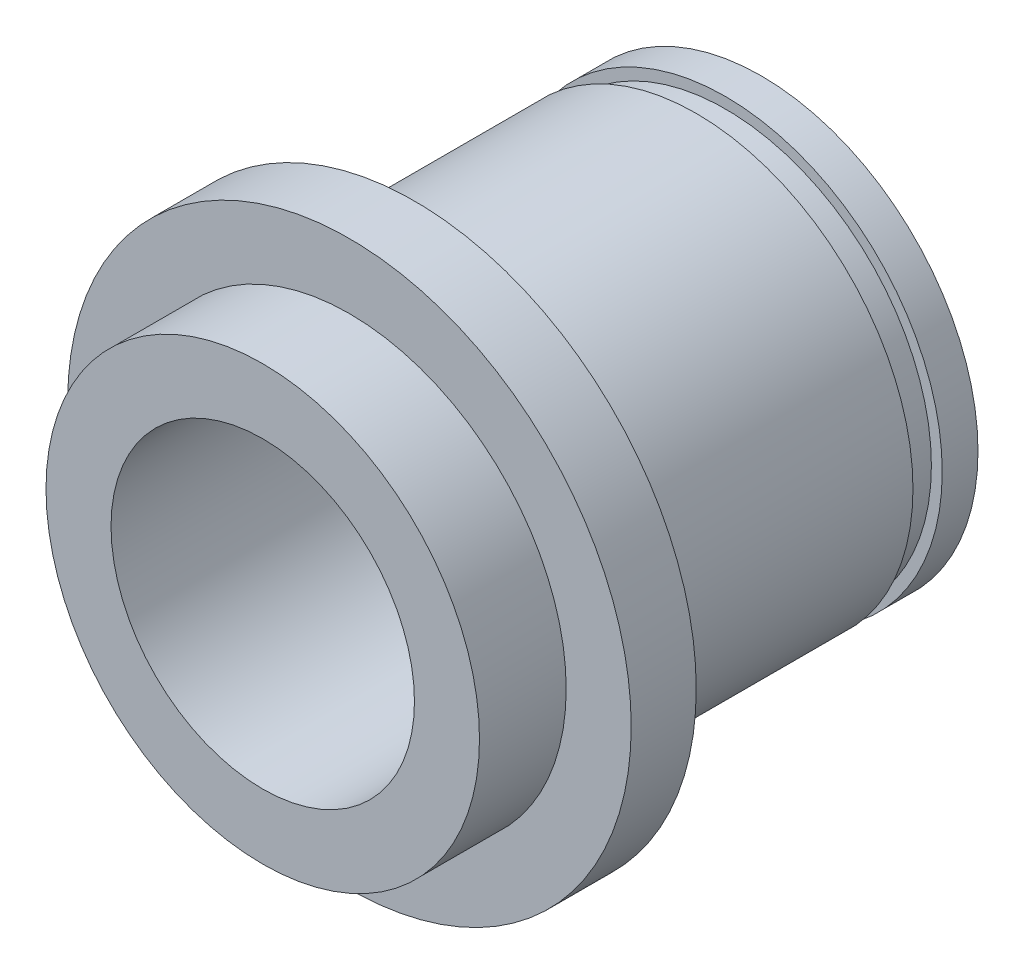
ISO-10303-21;
HEADER;
FILE_DESCRIPTION(('STEP AP214'),'2;1');
FILE_NAME('part.step','',(''),(''),'','','');
FILE_SCHEMA(('AUTOMOTIVE_DESIGN { 1 0 10303 214 1 1 1 1 }'));
ENDSEC;
DATA;
#1=APPLICATION_CONTEXT('core data for automotive mechanical design processes');
#2=APPLICATION_PROTOCOL_DEFINITION('international standard','automotive_design',2000,#1);
#3=PRODUCT_CONTEXT('',#1,'mechanical');
#4=PRODUCT('Part','Part','',(#3));
#5=PRODUCT_RELATED_PRODUCT_CATEGORY('part','',(#4));
#6=PRODUCT_DEFINITION_FORMATION('','',#4);
#7=PRODUCT_DEFINITION_CONTEXT('part definition',#1,'design');
#8=PRODUCT_DEFINITION('design','',#6,#7);
#9=PRODUCT_DEFINITION_SHAPE('','',#8);
#10=(LENGTH_UNIT() NAMED_UNIT(*) SI_UNIT(.MILLI.,.METRE.));
#11=(NAMED_UNIT(*) PLANE_ANGLE_UNIT() SI_UNIT($,.RADIAN.));
#12=(NAMED_UNIT(*) SI_UNIT($,.STERADIAN.) SOLID_ANGLE_UNIT());
#13=UNCERTAINTY_MEASURE_WITH_UNIT(LENGTH_MEASURE(1.E-05),#10,'distance_accuracy_value','');
#14=(GEOMETRIC_REPRESENTATION_CONTEXT(3) GLOBAL_UNCERTAINTY_ASSIGNED_CONTEXT((#13)) GLOBAL_UNIT_ASSIGNED_CONTEXT((#10,
#11,#12)) REPRESENTATION_CONTEXT('',''));
#15=CARTESIAN_POINT('',(0.,0.,0.));
#16=DIRECTION('',(0.,0.,1.));
#17=DIRECTION('',(1.,0.,0.));
#18=AXIS2_PLACEMENT_3D('',#15,#16,#17);
#19=CARTESIAN_POINT('',(0.,0.,7.));
#20=DIRECTION('',(0.,0.,-1.));
#21=DIRECTION('',(-1.,0.,0.));
#22=AXIS2_PLACEMENT_3D('',#19,#20,#21);
#23=PLANE('',#22);
#24=CARTESIAN_POINT('',(0.,0.,7.));
#25=DIRECTION('',(0.,0.,-1.));
#26=DIRECTION('',(-1.,0.,0.));
#27=AXIS2_PLACEMENT_3D('',#24,#25,#26);
#28=CIRCLE('',#27,7.);
#29=CARTESIAN_POINT('',(-7.,0.,7.));
#30=VERTEX_POINT('',#29);
#31=EDGE_CURVE('E76',#30,#30,#28,.T.);
#32=ORIENTED_EDGE('',*,*,#31,.T.);
#33=EDGE_LOOP('',(#32));
#34=FACE_BOUND('',#33,.T.);
#35=CARTESIAN_POINT('',(0.,0.,7.));
#36=DIRECTION('',(0.,0.,1.));
#37=DIRECTION('',(1.,0.,0.));
#38=AXIS2_PLACEMENT_3D('',#35,#36,#37);
#39=CIRCLE('',#38,10.);
#40=CARTESIAN_POINT('',(10.,0.,7.));
#41=VERTEX_POINT('',#40);
#42=EDGE_CURVE('E10',#41,#41,#39,.T.);
#43=ORIENTED_EDGE('',*,*,#42,.T.);
#44=EDGE_LOOP('',(#43));
#45=FACE_BOUND('',#44,.T.);
#46=ADVANCED_FACE('F39',(#34,#45),#23,.F.);
#47=CARTESIAN_POINT('',(0.,0.,15.9040178571429));
#48=DIRECTION('',(0.,0.,1.));
#49=DIRECTION('',(1.,0.,0.));
#50=AXIS2_PLACEMENT_3D('',#47,#48,#49);
#51=CYLINDRICAL_SURFACE('',#50,10.);
#52=ORIENTED_EDGE('',*,*,#42,.F.);
#53=EDGE_LOOP('',(#52));
#54=FACE_BOUND('',#53,.T.);
#55=CARTESIAN_POINT('',(0.,0.,3.));
#56=DIRECTION('',(0.,0.,1.));
#57=DIRECTION('',(1.,0.,0.));
#58=AXIS2_PLACEMENT_3D('',#55,#56,#57);
#59=CIRCLE('',#58,10.);
#60=CARTESIAN_POINT('',(10.,0.,3.));
#61=VERTEX_POINT('',#60);
#62=EDGE_CURVE('E45',#61,#61,#59,.T.);
#63=ORIENTED_EDGE('',*,*,#62,.T.);
#64=EDGE_LOOP('',(#63));
#65=FACE_BOUND('',#64,.T.);
#66=ADVANCED_FACE('F93',(#54,#65),#51,.T.);
#67=CARTESIAN_POINT('',(0.,10.,3.));
#68=DIRECTION('',(0.,0.,-1.));
#69=DIRECTION('',(-1.,0.,0.));
#70=AXIS2_PLACEMENT_3D('',#67,#68,#69);
#71=PLANE('',#70);
#72=ORIENTED_EDGE('',*,*,#62,.F.);
#73=EDGE_LOOP('',(#72));
#74=FACE_BOUND('',#73,.T.);
#75=CARTESIAN_POINT('',(0.,0.,3.));
#76=DIRECTION('',(0.,0.,1.));
#77=DIRECTION('',(1.,0.,0.));
#78=AXIS2_PLACEMENT_3D('',#75,#76,#77);
#79=CIRCLE('',#78,13.);
#80=CARTESIAN_POINT('',(13.,0.,3.));
#81=VERTEX_POINT('',#80);
#82=EDGE_CURVE('E49',#81,#81,#79,.T.);
#83=ORIENTED_EDGE('',*,*,#82,.T.);
#84=EDGE_LOOP('',(#83));
#85=FACE_BOUND('',#84,.T.);
#86=ADVANCED_FACE('F99',(#74,#85),#71,.F.);
#87=CARTESIAN_POINT('',(0.,0.,15.9040178571429));
#88=DIRECTION('',(0.,0.,1.));
#89=DIRECTION('',(1.,0.,0.));
#90=AXIS2_PLACEMENT_3D('',#87,#88,#89);
#91=CYLINDRICAL_SURFACE('',#90,13.);
#92=ORIENTED_EDGE('',*,*,#82,.F.);
#93=EDGE_LOOP('',(#92));
#94=FACE_BOUND('',#93,.T.);
#95=CARTESIAN_POINT('',(0.,0.,0.));
#96=DIRECTION('',(0.,0.,1.));
#97=DIRECTION('',(1.,0.,0.));
#98=AXIS2_PLACEMENT_3D('',#95,#96,#97);
#99=CIRCLE('',#98,13.);
#100=CARTESIAN_POINT('',(13.,0.,0.));
#101=VERTEX_POINT('',#100);
#102=EDGE_CURVE('E53',#101,#101,#99,.T.);
#103=ORIENTED_EDGE('',*,*,#102,.T.);
#104=EDGE_LOOP('',(#103));
#105=FACE_BOUND('',#104,.T.);
#106=ADVANCED_FACE('F104',(#94,#105),#91,.T.);
#107=CARTESIAN_POINT('',(0.,13.,0.));
#108=DIRECTION('',(0.,0.,1.));
#109=DIRECTION('',(1.,0.,0.));
#110=AXIS2_PLACEMENT_3D('',#107,#108,#109);
#111=PLANE('',#110);
#112=ORIENTED_EDGE('',*,*,#102,.F.);
#113=EDGE_LOOP('',(#112));
#114=FACE_BOUND('',#113,.T.);
#115=CARTESIAN_POINT('',(0.,0.,0.));
#116=DIRECTION('',(0.,0.,1.));
#117=DIRECTION('',(1.,0.,0.));
#118=AXIS2_PLACEMENT_3D('',#115,#116,#117);
#119=CIRCLE('',#118,10.);
#120=CARTESIAN_POINT('',(10.,0.,0.));
#121=VERTEX_POINT('',#120);
#122=EDGE_CURVE('E58',#121,#121,#119,.T.);
#123=ORIENTED_EDGE('',*,*,#122,.T.);
#124=EDGE_LOOP('',(#123));
#125=FACE_BOUND('',#124,.T.);
#126=ADVANCED_FACE('F110',(#114,#125),#111,.F.);
#127=CARTESIAN_POINT('',(0.,0.,15.9040178571429));
#128=DIRECTION('',(0.,0.,1.));
#129=DIRECTION('',(1.,0.,0.));
#130=AXIS2_PLACEMENT_3D('',#127,#128,#129);
#131=CYLINDRICAL_SURFACE('',#130,10.);
#132=ORIENTED_EDGE('',*,*,#122,.F.);
#133=EDGE_LOOP('',(#132));
#134=FACE_BOUND('',#133,.T.);
#135=CARTESIAN_POINT('',(0.,0.,-13.));
#136=DIRECTION('',(0.,0.,1.));
#137=DIRECTION('',(1.,0.,0.));
#138=AXIS2_PLACEMENT_3D('',#135,#136,#137);
#139=CIRCLE('',#138,10.);
#140=CARTESIAN_POINT('',(10.,0.,-13.));
#141=VERTEX_POINT('',#140);
#142=EDGE_CURVE('E61',#141,#141,#139,.T.);
#143=ORIENTED_EDGE('',*,*,#142,.T.);
#144=EDGE_LOOP('',(#143));
#145=FACE_BOUND('',#144,.T.);
#146=ADVANCED_FACE('F114',(#134,#145),#131,.T.);
#147=CARTESIAN_POINT('',(0.,10.,-13.));
#148=DIRECTION('',(0.,0.,1.));
#149=DIRECTION('',(1.,0.,0.));
#150=AXIS2_PLACEMENT_3D('',#147,#148,#149);
#151=PLANE('',#150);
#152=ORIENTED_EDGE('',*,*,#142,.F.);
#153=EDGE_LOOP('',(#152));
#154=FACE_BOUND('',#153,.T.);
#155=CARTESIAN_POINT('',(0.,0.,-13.));
#156=DIRECTION('',(0.,0.,1.));
#157=DIRECTION('',(1.,0.,0.));
#158=AXIS2_PLACEMENT_3D('',#155,#156,#157);
#159=CIRCLE('',#158,9.5);
#160=CARTESIAN_POINT('',(9.5,0.,-13.));
#161=VERTEX_POINT('',#160);
#162=EDGE_CURVE('E64',#161,#161,#159,.T.);
#163=ORIENTED_EDGE('',*,*,#162,.T.);
#164=EDGE_LOOP('',(#163));
#165=FACE_BOUND('',#164,.T.);
#166=ADVANCED_FACE('F118',(#154,#165),#151,.F.);
#167=CARTESIAN_POINT('',(0.,0.,15.9040178571429));
#168=DIRECTION('',(0.,0.,1.));
#169=DIRECTION('',(1.,0.,0.));
#170=AXIS2_PLACEMENT_3D('',#167,#168,#169);
#171=CYLINDRICAL_SURFACE('',#170,9.5);
#172=ORIENTED_EDGE('',*,*,#162,.F.);
#173=EDGE_LOOP('',(#172));
#174=FACE_BOUND('',#173,.T.);
#175=CARTESIAN_POINT('',(0.,0.,-14.35));
#176=DIRECTION('',(0.,0.,1.));
#177=DIRECTION('',(1.,0.,0.));
#178=AXIS2_PLACEMENT_3D('',#175,#176,#177);
#179=CIRCLE('',#178,9.5);
#180=CARTESIAN_POINT('',(9.5,0.,-14.35));
#181=VERTEX_POINT('',#180);
#182=EDGE_CURVE('E67',#181,#181,#179,.T.);
#183=ORIENTED_EDGE('',*,*,#182,.T.);
#184=EDGE_LOOP('',(#183));
#185=FACE_BOUND('',#184,.T.);
#186=ADVANCED_FACE('F122',(#174,#185),#171,.T.);
#187=CARTESIAN_POINT('',(0.,9.5,-14.35));
#188=DIRECTION('',(0.,0.,-1.));
#189=DIRECTION('',(-1.,0.,0.));
#190=AXIS2_PLACEMENT_3D('',#187,#188,#189);
#191=PLANE('',#190);
#192=ORIENTED_EDGE('',*,*,#182,.F.);
#193=EDGE_LOOP('',(#192));
#194=FACE_BOUND('',#193,.T.);
#195=CARTESIAN_POINT('',(0.,0.,-14.35));
#196=DIRECTION('',(0.,0.,1.));
#197=DIRECTION('',(1.,0.,0.));
#198=AXIS2_PLACEMENT_3D('',#195,#196,#197);
#199=CIRCLE('',#198,10.);
#200=CARTESIAN_POINT('',(10.,0.,-14.35));
#201=VERTEX_POINT('',#200);
#202=EDGE_CURVE('E70',#201,#201,#199,.T.);
#203=ORIENTED_EDGE('',*,*,#202,.T.);
#204=EDGE_LOOP('',(#203));
#205=FACE_BOUND('',#204,.T.);
#206=ADVANCED_FACE('F126',(#194,#205),#191,.F.);
#207=CARTESIAN_POINT('',(0.,0.,15.9040178571429));
#208=DIRECTION('',(0.,0.,1.));
#209=DIRECTION('',(1.,0.,0.));
#210=AXIS2_PLACEMENT_3D('',#207,#208,#209);
#211=CYLINDRICAL_SURFACE('',#210,10.);
#212=ORIENTED_EDGE('',*,*,#202,.F.);
#213=EDGE_LOOP('',(#212));
#214=FACE_BOUND('',#213,.T.);
#215=CARTESIAN_POINT('',(0.,0.,-16.));
#216=DIRECTION('',(0.,0.,1.));
#217=DIRECTION('',(1.,0.,0.));
#218=AXIS2_PLACEMENT_3D('',#215,#216,#217);
#219=CIRCLE('',#218,10.);
#220=CARTESIAN_POINT('',(10.,0.,-16.));
#221=VERTEX_POINT('',#220);
#222=EDGE_CURVE('E73',#221,#221,#219,.T.);
#223=ORIENTED_EDGE('',*,*,#222,.T.);
#224=EDGE_LOOP('',(#223));
#225=FACE_BOUND('',#224,.T.);
#226=ADVANCED_FACE('F130',(#214,#225),#211,.T.);
#227=CARTESIAN_POINT('',(0.,10.,-16.));
#228=DIRECTION('',(0.,0.,1.));
#229=DIRECTION('',(1.,0.,0.));
#230=AXIS2_PLACEMENT_3D('',#227,#228,#229);
#231=PLANE('',#230);
#232=CARTESIAN_POINT('',(0.,0.,-16.));
#233=DIRECTION('',(0.,0.,1.));
#234=DIRECTION('',(1.,0.,0.));
#235=AXIS2_PLACEMENT_3D('',#232,#233,#234);
#236=CIRCLE('',#235,7.);
#237=CARTESIAN_POINT('',(7.,0.,-16.));
#238=VERTEX_POINT('',#237);
#239=EDGE_CURVE('E79',#238,#238,#236,.T.);
#240=ORIENTED_EDGE('',*,*,#239,.T.);
#241=EDGE_LOOP('',(#240));
#242=FACE_BOUND('',#241,.T.);
#243=ORIENTED_EDGE('',*,*,#222,.F.);
#244=EDGE_LOOP('',(#243));
#245=FACE_BOUND('',#244,.T.);
#246=ADVANCED_FACE('F83',(#242,#245),#231,.F.);
#247=CARTESIAN_POINT('',(0.,0.,-16.));
#248=DIRECTION('',(0.,0.,1.));
#249=DIRECTION('',(1.,0.,0.));
#250=AXIS2_PLACEMENT_3D('',#247,#248,#249);
#251=CYLINDRICAL_SURFACE('',#250,7.);
#252=ORIENTED_EDGE('',*,*,#239,.F.);
#253=EDGE_LOOP('',(#252));
#254=FACE_BOUND('',#253,.T.);
#255=ORIENTED_EDGE('',*,*,#31,.F.);
#256=EDGE_LOOP('',(#255));
#257=FACE_BOUND('',#256,.T.);
#258=ADVANCED_FACE('F86',(#254,#257),#251,.F.);
#259=CLOSED_SHELL('',(#46,#66,#86,#106,#126,#146,#166,#186,#206,#226,#246,#258));
#260=MANIFOLD_SOLID_BREP('B2',#259);
#261=ADVANCED_BREP_SHAPE_REPRESENTATION('',(#18,#260),#14);
#262=SHAPE_DEFINITION_REPRESENTATION(#9,#261);
ENDSEC;
END-ISO-10303-21;
